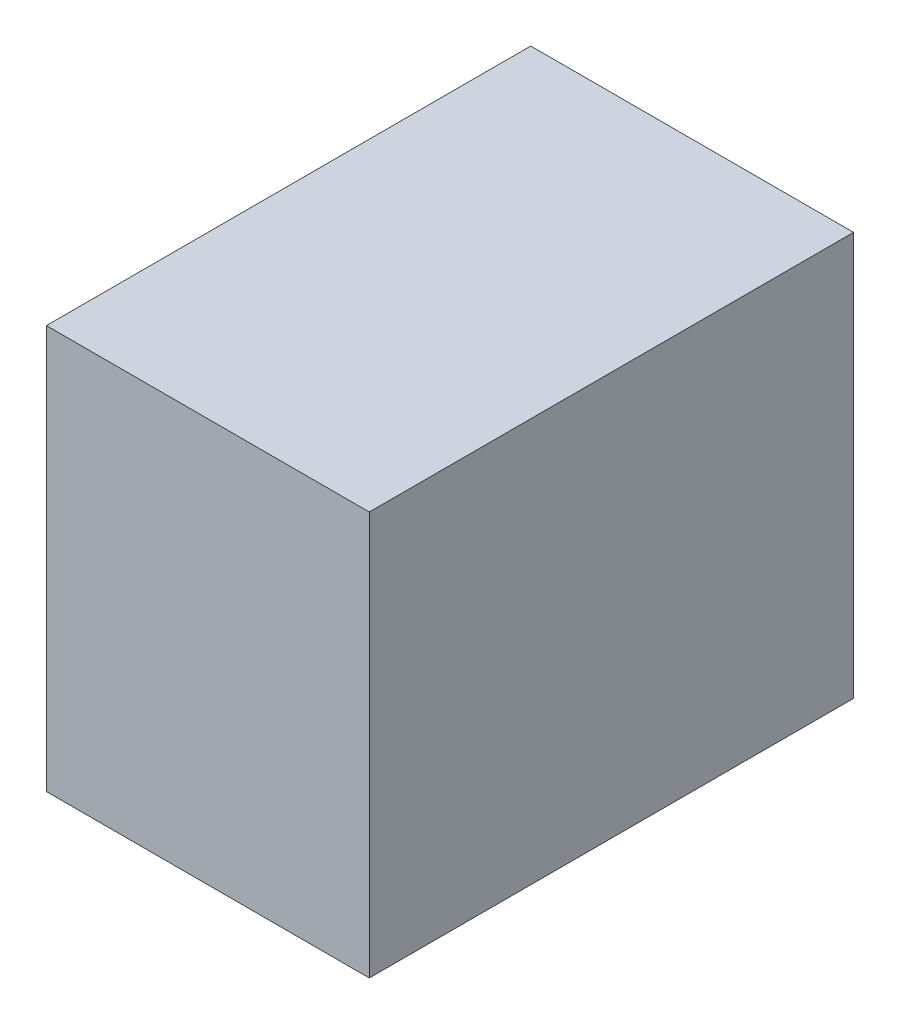
ISO-10303-21;
HEADER;
FILE_DESCRIPTION(('STEP AP214'),'2;1');
FILE_NAME('part.step','',(''),(''),'','','');
FILE_SCHEMA(('AUTOMOTIVE_DESIGN { 1 0 10303 214 1 1 1 1 }'));
ENDSEC;
DATA;
#1=APPLICATION_CONTEXT('core data for automotive mechanical design processes');
#2=APPLICATION_PROTOCOL_DEFINITION('international standard','automotive_design',2000,#1);
#3=PRODUCT_CONTEXT('',#1,'mechanical');
#4=PRODUCT('Part','Part','',(#3));
#5=PRODUCT_RELATED_PRODUCT_CATEGORY('part','',(#4));
#6=PRODUCT_DEFINITION_FORMATION('','',#4);
#7=PRODUCT_DEFINITION_CONTEXT('part definition',#1,'design');
#8=PRODUCT_DEFINITION('design','',#6,#7);
#9=PRODUCT_DEFINITION_SHAPE('','',#8);
#10=(LENGTH_UNIT() NAMED_UNIT(*) SI_UNIT(.MILLI.,.METRE.));
#11=(NAMED_UNIT(*) PLANE_ANGLE_UNIT() SI_UNIT($,.RADIAN.));
#12=(NAMED_UNIT(*) SI_UNIT($,.STERADIAN.) SOLID_ANGLE_UNIT());
#13=UNCERTAINTY_MEASURE_WITH_UNIT(LENGTH_MEASURE(1.E-05),#10,'distance_accuracy_value','');
#14=(GEOMETRIC_REPRESENTATION_CONTEXT(3) GLOBAL_UNCERTAINTY_ASSIGNED_CONTEXT((#13)) GLOBAL_UNIT_ASSIGNED_CONTEXT((#10,
#11,#12)) REPRESENTATION_CONTEXT('',''));
#15=CARTESIAN_POINT('',(0.,0.,0.));
#16=DIRECTION('',(0.,0.,1.));
#17=DIRECTION('',(1.,0.,0.));
#18=AXIS2_PLACEMENT_3D('',#15,#16,#17);
#19=CARTESIAN_POINT('',(220.,320.,-680.));
#20=DIRECTION('',(-1.,0.,0.));
#21=DIRECTION('',(0.,0.,1.));
#22=AXIS2_PLACEMENT_3D('',#19,#20,#21);
#23=PLANE('',#22);
#24=DIRECTION('',(0.,-1.,0.));
#25=VECTOR('',#24,1.);
#26=CARTESIAN_POINT('',(220.,320.,-620.));
#27=LINE('',#26,#25);
#28=CARTESIAN_POINT('',(220.,370.,-620.));
#29=VERTEX_POINT('',#28);
#30=CARTESIAN_POINT('',(220.,320.,-620.));
#31=VERTEX_POINT('',#30);
#32=EDGE_CURVE('E103',#29,#31,#27,.T.);
#33=ORIENTED_EDGE('',*,*,#32,.F.);
#34=DIRECTION('',(0.,0.,1.));
#35=VECTOR('',#34,1.);
#36=CARTESIAN_POINT('',(220.,370.,-680.));
#37=LINE('',#36,#35);
#38=CARTESIAN_POINT('',(220.,370.,-680.));
#39=VERTEX_POINT('',#38);
#40=EDGE_CURVE('E11',#39,#29,#37,.T.);
#41=ORIENTED_EDGE('',*,*,#40,.F.);
#42=DIRECTION('',(0.,-1.,0.));
#43=VECTOR('',#42,1.);
#44=CARTESIAN_POINT('',(220.,320.,-680.));
#45=LINE('',#44,#43);
#46=CARTESIAN_POINT('',(220.,320.,-680.));
#47=VERTEX_POINT('',#46);
#48=EDGE_CURVE('E97',#39,#47,#45,.T.);
#49=ORIENTED_EDGE('',*,*,#48,.T.);
#50=DIRECTION('',(0.,0.,1.));
#51=VECTOR('',#50,1.);
#52=CARTESIAN_POINT('',(220.,320.,-680.));
#53=LINE('',#52,#51);
#54=EDGE_CURVE('E42',#47,#31,#53,.T.);
#55=ORIENTED_EDGE('',*,*,#54,.T.);
#56=EDGE_LOOP('',(#33,#41,#49,#55));
#57=FACE_BOUND('',#56,.T.);
#58=ADVANCED_FACE('F39',(#57),#23,.T.);
#59=CARTESIAN_POINT('',(220.,370.,-680.));
#60=DIRECTION('',(0.,1.,0.));
#61=DIRECTION('',(0.,0.,1.));
#62=AXIS2_PLACEMENT_3D('',#59,#60,#61);
#63=PLANE('',#62);
#64=DIRECTION('',(-1.,0.,0.));
#65=VECTOR('',#64,1.);
#66=CARTESIAN_POINT('',(220.,370.,-620.));
#67=LINE('',#66,#65);
#68=CARTESIAN_POINT('',(260.,370.,-620.));
#69=VERTEX_POINT('',#68);
#70=EDGE_CURVE('E99',#69,#29,#67,.T.);
#71=ORIENTED_EDGE('',*,*,#70,.F.);
#72=DIRECTION('',(0.,0.,1.));
#73=VECTOR('',#72,1.);
#74=CARTESIAN_POINT('',(260.,370.,-680.));
#75=LINE('',#74,#73);
#76=CARTESIAN_POINT('',(260.,370.,-680.));
#77=VERTEX_POINT('',#76);
#78=EDGE_CURVE('E48',#77,#69,#75,.T.);
#79=ORIENTED_EDGE('',*,*,#78,.F.);
#80=DIRECTION('',(-1.,0.,0.));
#81=VECTOR('',#80,1.);
#82=CARTESIAN_POINT('',(220.,370.,-680.));
#83=LINE('',#82,#81);
#84=EDGE_CURVE('E94',#77,#39,#83,.T.);
#85=ORIENTED_EDGE('',*,*,#84,.T.);
#86=ORIENTED_EDGE('',*,*,#40,.T.);
#87=EDGE_LOOP('',(#71,#79,#85,#86));
#88=FACE_BOUND('',#87,.T.);
#89=ADVANCED_FACE('F113',(#88),#63,.T.);
#90=CARTESIAN_POINT('',(260.,320.,-680.));
#91=DIRECTION('',(1.,0.,0.));
#92=DIRECTION('',(0.,0.,-1.));
#93=AXIS2_PLACEMENT_3D('',#90,#91,#92);
#94=PLANE('',#93);
#95=DIRECTION('',(0.,1.,0.));
#96=VECTOR('',#95,1.);
#97=CARTESIAN_POINT('',(260.,320.,-620.));
#98=LINE('',#97,#96);
#99=CARTESIAN_POINT('',(260.,320.,-620.));
#100=VERTEX_POINT('',#99);
#101=EDGE_CURVE('E89',#100,#69,#98,.T.);
#102=ORIENTED_EDGE('',*,*,#101,.F.);
#103=DIRECTION('',(0.,0.,1.));
#104=VECTOR('',#103,1.);
#105=CARTESIAN_POINT('',(260.,320.,-680.));
#106=LINE('',#105,#104);
#107=CARTESIAN_POINT('',(260.,320.,-680.));
#108=VERTEX_POINT('',#107);
#109=EDGE_CURVE('E84',#108,#100,#106,.T.);
#110=ORIENTED_EDGE('',*,*,#109,.F.);
#111=DIRECTION('',(0.,1.,0.));
#112=VECTOR('',#111,1.);
#113=CARTESIAN_POINT('',(260.,320.,-680.));
#114=LINE('',#113,#112);
#115=EDGE_CURVE('E87',#108,#77,#114,.T.);
#116=ORIENTED_EDGE('',*,*,#115,.T.);
#117=ORIENTED_EDGE('',*,*,#78,.T.);
#118=EDGE_LOOP('',(#102,#110,#116,#117));
#119=FACE_BOUND('',#118,.T.);
#120=ADVANCED_FACE('F86',(#119),#94,.T.);
#121=CARTESIAN_POINT('',(220.,320.,-680.));
#122=DIRECTION('',(0.,-1.,0.));
#123=DIRECTION('',(0.,0.,-1.));
#124=AXIS2_PLACEMENT_3D('',#121,#122,#123);
#125=PLANE('',#124);
#126=DIRECTION('',(1.,0.,0.));
#127=VECTOR('',#126,1.);
#128=CARTESIAN_POINT('',(220.,320.,-620.));
#129=LINE('',#128,#127);
#130=EDGE_CURVE('E106',#31,#100,#129,.T.);
#131=ORIENTED_EDGE('',*,*,#130,.F.);
#132=ORIENTED_EDGE('',*,*,#54,.F.);
#133=DIRECTION('',(1.,0.,0.));
#134=VECTOR('',#133,1.);
#135=CARTESIAN_POINT('',(220.,320.,-680.));
#136=LINE('',#135,#134);
#137=EDGE_CURVE('E93',#47,#108,#136,.T.);
#138=ORIENTED_EDGE('',*,*,#137,.T.);
#139=ORIENTED_EDGE('',*,*,#109,.T.);
#140=EDGE_LOOP('',(#131,#132,#138,#139));
#141=FACE_BOUND('',#140,.T.);
#142=ADVANCED_FACE('F96',(#141),#125,.T.);
#143=CARTESIAN_POINT('',(0.,0.,-680.));
#144=DIRECTION('',(0.,0.,-1.));
#145=DIRECTION('',(-1.,0.,0.));
#146=AXIS2_PLACEMENT_3D('',#143,#144,#145);
#147=PLANE('',#146);
#148=ORIENTED_EDGE('',*,*,#48,.F.);
#149=ORIENTED_EDGE('',*,*,#84,.F.);
#150=ORIENTED_EDGE('',*,*,#115,.F.);
#151=ORIENTED_EDGE('',*,*,#137,.F.);
#152=EDGE_LOOP('',(#148,#149,#150,#151));
#153=FACE_BOUND('',#152,.T.);
#154=ADVANCED_FACE('F92',(#153),#147,.T.);
#155=CARTESIAN_POINT('',(0.,0.,-620.));
#156=DIRECTION('',(0.,0.,-1.));
#157=DIRECTION('',(-1.,0.,0.));
#158=AXIS2_PLACEMENT_3D('',#155,#156,#157);
#159=PLANE('',#158);
#160=ORIENTED_EDGE('',*,*,#32,.T.);
#161=ORIENTED_EDGE('',*,*,#130,.T.);
#162=ORIENTED_EDGE('',*,*,#101,.T.);
#163=ORIENTED_EDGE('',*,*,#70,.T.);
#164=EDGE_LOOP('',(#160,#161,#162,#163));
#165=FACE_BOUND('',#164,.T.);
#166=ADVANCED_FACE('F112',(#165),#159,.F.);
#167=CLOSED_SHELL('',(#58,#89,#120,#142,#154,#166));
#168=MANIFOLD_SOLID_BREP('B2',#167);
#169=ADVANCED_BREP_SHAPE_REPRESENTATION('',(#18,#168),#14);
#170=SHAPE_DEFINITION_REPRESENTATION(#9,#169);
ENDSEC;
END-ISO-10303-21;
